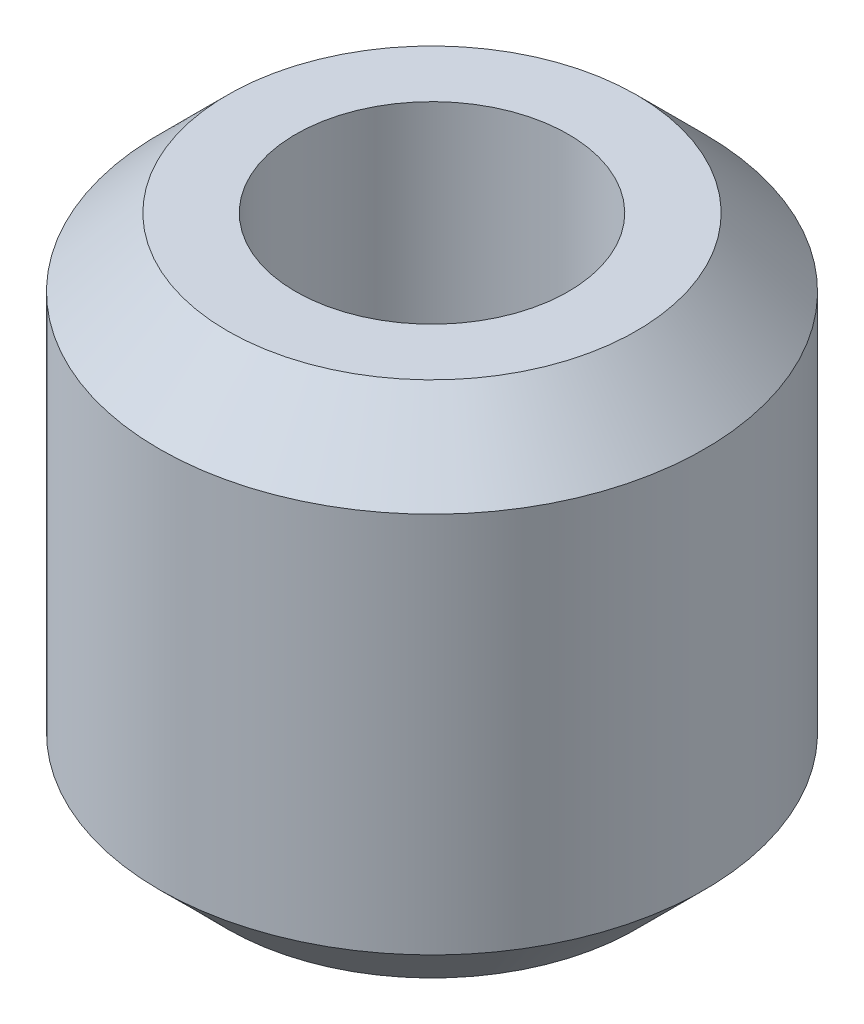
ISO-10303-21;
HEADER;
FILE_DESCRIPTION(('STEP AP214'),'2;1');
FILE_NAME('part.step','',(''),(''),'','','');
FILE_SCHEMA(('AUTOMOTIVE_DESIGN { 1 0 10303 214 1 1 1 1 }'));
ENDSEC;
DATA;
#1=APPLICATION_CONTEXT('core data for automotive mechanical design processes');
#2=APPLICATION_PROTOCOL_DEFINITION('international standard','automotive_design',2000,#1);
#3=PRODUCT_CONTEXT('',#1,'mechanical');
#4=PRODUCT('Part','Part','',(#3));
#5=PRODUCT_RELATED_PRODUCT_CATEGORY('part','',(#4));
#6=PRODUCT_DEFINITION_FORMATION('','',#4);
#7=PRODUCT_DEFINITION_CONTEXT('part definition',#1,'design');
#8=PRODUCT_DEFINITION('design','',#6,#7);
#9=PRODUCT_DEFINITION_SHAPE('','',#8);
#10=(LENGTH_UNIT() NAMED_UNIT(*) SI_UNIT(.MILLI.,.METRE.));
#11=(NAMED_UNIT(*) PLANE_ANGLE_UNIT() SI_UNIT($,.RADIAN.));
#12=(NAMED_UNIT(*) SI_UNIT($,.STERADIAN.) SOLID_ANGLE_UNIT());
#13=UNCERTAINTY_MEASURE_WITH_UNIT(LENGTH_MEASURE(1.E-05),#10,'distance_accuracy_value','');
#14=(GEOMETRIC_REPRESENTATION_CONTEXT(3) GLOBAL_UNCERTAINTY_ASSIGNED_CONTEXT((#13)) GLOBAL_UNIT_ASSIGNED_CONTEXT((#10,
#11,#12)) REPRESENTATION_CONTEXT('',''));
#15=CARTESIAN_POINT('',(0.,0.,0.));
#16=DIRECTION('',(0.,0.,1.));
#17=DIRECTION('',(1.,0.,0.));
#18=AXIS2_PLACEMENT_3D('',#15,#16,#17);
#19=CARTESIAN_POINT('',(0.,14.3902433245803,0.));
#20=DIRECTION('',(0.,1.,0.));
#21=DIRECTION('',(0.,0.,1.));
#22=AXIS2_PLACEMENT_3D('',#19,#20,#21);
#23=CYLINDRICAL_SURFACE('',#22,5.);
#24=CARTESIAN_POINT('',(0.,-6.7007299270073,0.));
#25=DIRECTION('',(0.,1.,0.));
#26=DIRECTION('',(0.,0.,1.));
#27=AXIS2_PLACEMENT_3D('',#24,#25,#26);
#28=CIRCLE('',#27,5.);
#29=CARTESIAN_POINT('',(0.,-6.7007299270073,5.));
#30=VERTEX_POINT('',#29);
#31=EDGE_CURVE('E67',#30,#30,#28,.T.);
#32=ORIENTED_EDGE('',*,*,#31,.F.);
#33=EDGE_LOOP('',(#32));
#34=FACE_BOUND('',#33,.T.);
#35=CARTESIAN_POINT('',(0.,12.2992700729927,0.));
#36=DIRECTION('',(0.,1.,0.));
#37=DIRECTION('',(0.,0.,1.));
#38=AXIS2_PLACEMENT_3D('',#35,#36,#37);
#39=CIRCLE('',#38,5.);
#40=CARTESIAN_POINT('',(0.,12.2992700729927,5.));
#41=VERTEX_POINT('',#40);
#42=EDGE_CURVE('E64',#41,#41,#39,.T.);
#43=ORIENTED_EDGE('',*,*,#42,.T.);
#44=EDGE_LOOP('',(#43));
#45=FACE_BOUND('',#44,.T.);
#46=ADVANCED_FACE('F43',(#34,#45),#23,.F.);
#47=CARTESIAN_POINT('',(0.,12.2992700729927,0.));
#48=DIRECTION('',(0.,-1.,0.));
#49=DIRECTION('',(0.,0.,-1.));
#50=AXIS2_PLACEMENT_3D('',#47,#48,#49);
#51=PLANE('',#50);
#52=CARTESIAN_POINT('',(0.,12.2992700729927,0.));
#53=DIRECTION('',(0.,-1.,0.));
#54=DIRECTION('',(0.,0.,-1.));
#55=AXIS2_PLACEMENT_3D('',#52,#53,#54);
#56=CIRCLE('',#55,7.49999999999999);
#57=CARTESIAN_POINT('',(0.,12.2992700729927,-7.49999999999999));
#58=VERTEX_POINT('',#57);
#59=EDGE_CURVE('E59',#58,#58,#56,.F.);
#60=ORIENTED_EDGE('',*,*,#59,.T.);
#61=EDGE_LOOP('',(#60));
#62=FACE_BOUND('',#61,.T.);
#63=ORIENTED_EDGE('',*,*,#42,.F.);
#64=EDGE_LOOP('',(#63));
#65=FACE_BOUND('',#64,.T.);
#66=ADVANCED_FACE('F75',(#62,#65),#51,.F.);
#67=CARTESIAN_POINT('',(0.,14.3902433245803,0.));
#68=DIRECTION('',(0.,1.,0.));
#69=DIRECTION('',(0.,0.,1.));
#70=AXIS2_PLACEMENT_3D('',#67,#68,#69);
#71=CYLINDRICAL_SURFACE('',#70,10.);
#72=CARTESIAN_POINT('',(0.,-4.20072992700729,0.));
#73=DIRECTION('',(0.,-1.,0.));
#74=DIRECTION('',(0.,0.,-1.));
#75=AXIS2_PLACEMENT_3D('',#72,#73,#74);
#76=CIRCLE('',#75,10.);
#77=CARTESIAN_POINT('',(0.,-4.20072992700729,-10.));
#78=VERTEX_POINT('',#77);
#79=EDGE_CURVE('E51',#78,#78,#76,.F.);
#80=ORIENTED_EDGE('',*,*,#79,.T.);
#81=EDGE_LOOP('',(#80));
#82=FACE_BOUND('',#81,.T.);
#83=CARTESIAN_POINT('',(0.,9.79927007299268,0.));
#84=DIRECTION('',(0.,-1.,0.));
#85=DIRECTION('',(0.,0.,-1.));
#86=AXIS2_PLACEMENT_3D('',#83,#84,#85);
#87=CIRCLE('',#86,10.);
#88=CARTESIAN_POINT('',(0.,9.79927007299268,-10.));
#89=VERTEX_POINT('',#88);
#90=EDGE_CURVE('E55',#89,#89,#87,.T.);
#91=ORIENTED_EDGE('',*,*,#90,.T.);
#92=EDGE_LOOP('',(#91));
#93=FACE_BOUND('',#92,.T.);
#94=ADVANCED_FACE('F80',(#82,#93),#71,.T.);
#95=CARTESIAN_POINT('',(0.,-6.7007299270073,0.));
#96=DIRECTION('',(0.,-1.,0.));
#97=DIRECTION('',(0.,0.,-1.));
#98=AXIS2_PLACEMENT_3D('',#95,#96,#97);
#99=PLANE('',#98);
#100=CARTESIAN_POINT('',(0.,-6.7007299270073,0.));
#101=DIRECTION('',(0.,-1.,0.));
#102=DIRECTION('',(0.,0.,-1.));
#103=AXIS2_PLACEMENT_3D('',#100,#101,#102);
#104=CIRCLE('',#103,7.49999999999998);
#105=CARTESIAN_POINT('',(0.,-6.7007299270073,-7.49999999999998));
#106=VERTEX_POINT('',#105);
#107=EDGE_CURVE('E10',#106,#106,#104,.T.);
#108=ORIENTED_EDGE('',*,*,#107,.T.);
#109=EDGE_LOOP('',(#108));
#110=FACE_BOUND('',#109,.T.);
#111=ORIENTED_EDGE('',*,*,#31,.T.);
#112=EDGE_LOOP('',(#111));
#113=FACE_BOUND('',#112,.T.);
#114=ADVANCED_FACE('F71',(#110,#113),#99,.T.);
#115=CARTESIAN_POINT('',(0.,12.2992700729927,0.));
#116=DIRECTION('',(0.,-1.,0.));
#117=DIRECTION('',(0.,0.,-1.));
#118=AXIS2_PLACEMENT_3D('',#115,#116,#117);
#119=CONICAL_SURFACE('',#118,7.49999999999999,0.785398163397446);
#120=ORIENTED_EDGE('',*,*,#90,.F.);
#121=EDGE_LOOP('',(#120));
#122=FACE_BOUND('',#121,.T.);
#123=ORIENTED_EDGE('',*,*,#59,.F.);
#124=EDGE_LOOP('',(#123));
#125=FACE_BOUND('',#124,.T.);
#126=ADVANCED_FACE('F90',(#122,#125),#119,.T.);
#127=CARTESIAN_POINT('',(0.,-4.20072992700729,0.));
#128=DIRECTION('',(0.,1.,0.));
#129=DIRECTION('',(0.,0.,1.));
#130=AXIS2_PLACEMENT_3D('',#127,#128,#129);
#131=CONICAL_SURFACE('',#130,10.,0.78539816339745);
#132=ORIENTED_EDGE('',*,*,#107,.F.);
#133=EDGE_LOOP('',(#132));
#134=FACE_BOUND('',#133,.T.);
#135=ORIENTED_EDGE('',*,*,#79,.F.);
#136=EDGE_LOOP('',(#135));
#137=FACE_BOUND('',#136,.T.);
#138=ADVANCED_FACE('F46',(#134,#137),#131,.T.);
#139=CLOSED_SHELL('',(#46,#66,#94,#114,#126,#138));
#140=MANIFOLD_SOLID_BREP('B2',#139);
#141=ADVANCED_BREP_SHAPE_REPRESENTATION('',(#18,#140),#14);
#142=SHAPE_DEFINITION_REPRESENTATION(#9,#141);
ENDSEC;
END-ISO-10303-21;
